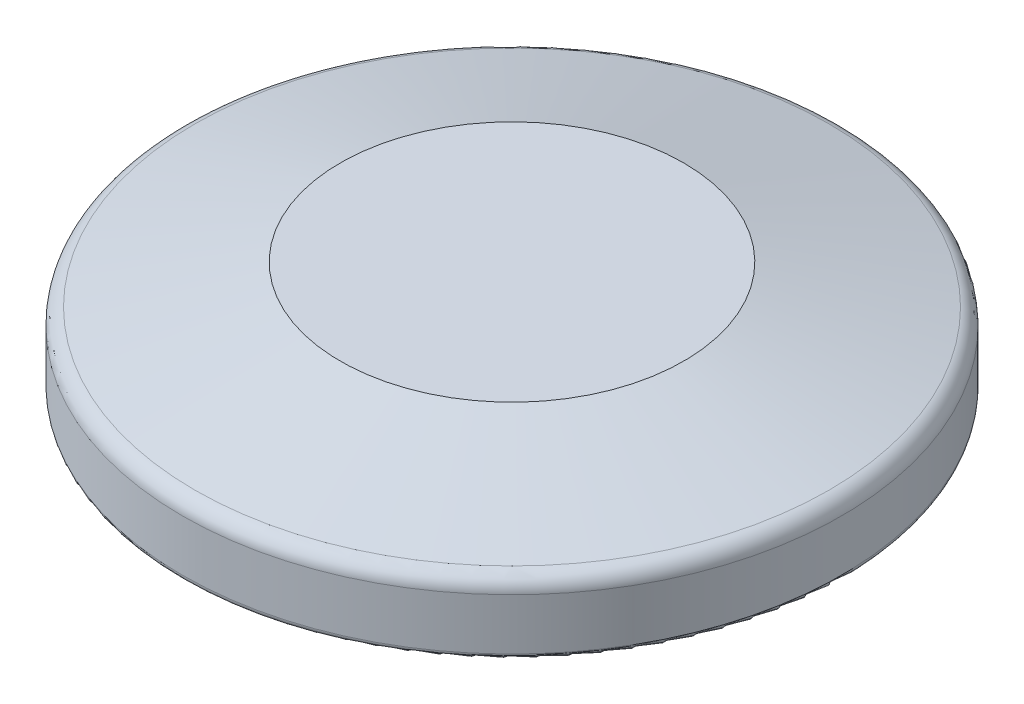
ISO-10303-21;
HEADER;
FILE_DESCRIPTION(('STEP AP214'),'2;1');
FILE_NAME('part.step','',(''),(''),'','','');
FILE_SCHEMA(('AUTOMOTIVE_DESIGN { 1 0 10303 214 1 1 1 1 }'));
ENDSEC;
DATA;
#1=APPLICATION_CONTEXT('core data for automotive mechanical design processes');
#2=APPLICATION_PROTOCOL_DEFINITION('international standard','automotive_design',2000,#1);
#3=PRODUCT_CONTEXT('',#1,'mechanical');
#4=PRODUCT('Part','Part','',(#3));
#5=PRODUCT_RELATED_PRODUCT_CATEGORY('part','',(#4));
#6=PRODUCT_DEFINITION_FORMATION('','',#4);
#7=PRODUCT_DEFINITION_CONTEXT('part definition',#1,'design');
#8=PRODUCT_DEFINITION('design','',#6,#7);
#9=PRODUCT_DEFINITION_SHAPE('','',#8);
#10=(LENGTH_UNIT() NAMED_UNIT(*) SI_UNIT(.MILLI.,.METRE.));
#11=(NAMED_UNIT(*) PLANE_ANGLE_UNIT() SI_UNIT($,.RADIAN.));
#12=(NAMED_UNIT(*) SI_UNIT($,.STERADIAN.) SOLID_ANGLE_UNIT());
#13=UNCERTAINTY_MEASURE_WITH_UNIT(LENGTH_MEASURE(1.E-05),#10,'distance_accuracy_value','');
#14=(GEOMETRIC_REPRESENTATION_CONTEXT(3) GLOBAL_UNCERTAINTY_ASSIGNED_CONTEXT((#13)) GLOBAL_UNIT_ASSIGNED_CONTEXT((#10,
#11,#12)) REPRESENTATION_CONTEXT('',''));
#15=CARTESIAN_POINT('',(0.,0.,0.));
#16=DIRECTION('',(0.,0.,1.));
#17=DIRECTION('',(1.,0.,0.));
#18=AXIS2_PLACEMENT_3D('',#15,#16,#17);
#19=CARTESIAN_POINT('',(0.,0.254000000000001,0.));
#20=DIRECTION('',(0.,1.,0.));
#21=DIRECTION('',(0.,0.,1.));
#22=AXIS2_PLACEMENT_3D('',#19,#20,#21);
#23=TOROIDAL_SURFACE('',#22,14.746,0.254);
#24=CARTESIAN_POINT('',(0.,0.254000000000001,0.));
#25=DIRECTION('',(0.,1.,0.));
#26=DIRECTION('',(0.,0.,1.));
#27=AXIS2_PLACEMENT_3D('',#24,#25,#26);
#28=CIRCLE('',#27,15.);
#29=CARTESIAN_POINT('',(0.,0.254000000000001,15.));
#30=VERTEX_POINT('',#29);
#31=EDGE_CURVE('E70',#30,#30,#28,.T.);
#32=ORIENTED_EDGE('',*,*,#31,.F.);
#33=EDGE_LOOP('',(#32));
#34=FACE_BOUND('',#33,.T.);
#35=CARTESIAN_POINT('',(0.,0.,0.));
#36=DIRECTION('',(0.,-1.,0.));
#37=DIRECTION('',(0.,0.,1.));
#38=AXIS2_PLACEMENT_3D('',#35,#36,#37);
#39=CIRCLE('',#38,14.746);
#40=CARTESIAN_POINT('',(0.,0.,14.746));
#41=VERTEX_POINT('',#40);
#42=EDGE_CURVE('E35',#41,#41,#39,.T.);
#43=ORIENTED_EDGE('',*,*,#42,.F.);
#44=EDGE_LOOP('',(#43));
#45=FACE_BOUND('',#44,.T.);
#46=ADVANCED_FACE('F15',(#34,#45),#23,.T.);
#47=CARTESIAN_POINT('',(0.,2.59029683516003,0.));
#48=DIRECTION('',(0.,1.,0.));
#49=DIRECTION('',(0.,0.,1.));
#50=AXIS2_PLACEMENT_3D('',#47,#48,#49);
#51=TOROIDAL_SURFACE('',#50,14.238,0.762);
#52=CARTESIAN_POINT('',(0.,3.3263323147923,0.));
#53=DIRECTION('',(0.,1.,0.));
#54=DIRECTION('',(0.,0.,1.));
#55=AXIS2_PLACEMENT_3D('',#52,#53,#54);
#56=CIRCLE('',#55,14.4352201123681);
#57=CARTESIAN_POINT('',(0.,3.3263323147923,14.4352201123681));
#58=VERTEX_POINT('',#57);
#59=EDGE_CURVE('E30',#58,#58,#56,.T.);
#60=ORIENTED_EDGE('',*,*,#59,.F.);
#61=EDGE_LOOP('',(#60));
#62=FACE_BOUND('',#61,.T.);
#63=CARTESIAN_POINT('',(0.,2.59029683516003,0.));
#64=DIRECTION('',(0.,-1.,0.));
#65=DIRECTION('',(0.,0.,1.));
#66=AXIS2_PLACEMENT_3D('',#63,#64,#65);
#67=CIRCLE('',#66,15.);
#68=CARTESIAN_POINT('',(0.,2.59029683516003,15.));
#69=VERTEX_POINT('',#68);
#70=EDGE_CURVE('E75',#69,#69,#67,.T.);
#71=ORIENTED_EDGE('',*,*,#70,.F.);
#72=EDGE_LOOP('',(#71));
#73=FACE_BOUND('',#72,.T.);
#74=ADVANCED_FACE('F56',(#62,#73),#51,.T.);
#75=CARTESIAN_POINT('',(0.,0.,0.));
#76=DIRECTION('',(0.,1.,0.));
#77=DIRECTION('',(0.,0.,1.));
#78=AXIS2_PLACEMENT_3D('',#75,#76,#77);
#79=CYLINDRICAL_SURFACE('',#78,4.65);
#80=CARTESIAN_POINT('',(0.,2.5,0.));
#81=DIRECTION('',(0.,1.,0.));
#82=DIRECTION('',(0.,0.,1.));
#83=AXIS2_PLACEMENT_3D('',#80,#81,#82);
#84=CIRCLE('',#83,4.65);
#85=CARTESIAN_POINT('',(0.,2.5,4.65));
#86=VERTEX_POINT('',#85);
#87=EDGE_CURVE('E32',#86,#86,#84,.T.);
#88=ORIENTED_EDGE('',*,*,#87,.F.);
#89=EDGE_LOOP('',(#88));
#90=FACE_BOUND('',#89,.T.);
#91=CARTESIAN_POINT('',(0.,0.,0.));
#92=DIRECTION('',(0.,1.,0.));
#93=DIRECTION('',(0.,0.,1.));
#94=AXIS2_PLACEMENT_3D('',#91,#92,#93);
#95=CIRCLE('',#94,4.65);
#96=CARTESIAN_POINT('',(0.,0.,4.65));
#97=VERTEX_POINT('',#96);
#98=EDGE_CURVE('E10',#97,#97,#95,.T.);
#99=ORIENTED_EDGE('',*,*,#98,.T.);
#100=EDGE_LOOP('',(#99));
#101=FACE_BOUND('',#100,.T.);
#102=ADVANCED_FACE('F45',(#90,#101),#79,.T.);
#103=CARTESIAN_POINT('',(0.,0.,0.));
#104=DIRECTION('',(0.,-1.,0.));
#105=DIRECTION('',(0.,0.,-1.));
#106=AXIS2_PLACEMENT_3D('',#103,#104,#105);
#107=CYLINDRICAL_SURFACE('',#106,8.6);
#108=CARTESIAN_POINT('',(0.,0.,0.));
#109=DIRECTION('',(0.,-1.,0.));
#110=DIRECTION('',(0.,0.,-1.));
#111=AXIS2_PLACEMENT_3D('',#108,#109,#110);
#112=CIRCLE('',#111,8.6);
#113=CARTESIAN_POINT('',(0.,0.,-8.6));
#114=VERTEX_POINT('',#113);
#115=EDGE_CURVE('E23',#114,#114,#112,.T.);
#116=ORIENTED_EDGE('',*,*,#115,.T.);
#117=EDGE_LOOP('',(#116));
#118=FACE_BOUND('',#117,.T.);
#119=CARTESIAN_POINT('',(0.,2.5,0.));
#120=DIRECTION('',(0.,-1.,0.));
#121=DIRECTION('',(0.,0.,-1.));
#122=AXIS2_PLACEMENT_3D('',#119,#120,#121);
#123=CIRCLE('',#122,8.6);
#124=CARTESIAN_POINT('',(0.,2.5,-8.6));
#125=VERTEX_POINT('',#124);
#126=EDGE_CURVE('E36',#125,#125,#123,.T.);
#127=ORIENTED_EDGE('',*,*,#126,.F.);
#128=EDGE_LOOP('',(#127));
#129=FACE_BOUND('',#128,.T.);
#130=ADVANCED_FACE('F42',(#118,#129),#107,.F.);
#131=CARTESIAN_POINT('',(0.,5.1,0.));
#132=DIRECTION('',(0.,-1.,0.));
#133=DIRECTION('',(0.,0.,-1.));
#134=AXIS2_PLACEMENT_3D('',#131,#132,#133);
#135=CONICAL_SURFACE('',#134,7.81580219542982,1.30899693899575);
#136=ORIENTED_EDGE('',*,*,#59,.T.);
#137=EDGE_LOOP('',(#136));
#138=FACE_BOUND('',#137,.T.);
#139=CARTESIAN_POINT('',(0.,5.1,0.));
#140=DIRECTION('',(0.,-1.,0.));
#141=DIRECTION('',(0.,0.,-1.));
#142=AXIS2_PLACEMENT_3D('',#139,#140,#141);
#143=CIRCLE('',#142,7.81580219542982);
#144=CARTESIAN_POINT('',(0.,5.1,-7.81580219542982));
#145=VERTEX_POINT('',#144);
#146=EDGE_CURVE('E19',#145,#145,#143,.T.);
#147=ORIENTED_EDGE('',*,*,#146,.T.);
#148=EDGE_LOOP('',(#147));
#149=FACE_BOUND('',#148,.T.);
#150=ADVANCED_FACE('F44',(#138,#149),#135,.T.);
#151=CARTESIAN_POINT('',(0.,0.,0.));
#152=DIRECTION('',(0.,-1.,0.));
#153=DIRECTION('',(0.,0.,-1.));
#154=AXIS2_PLACEMENT_3D('',#151,#152,#153);
#155=CYLINDRICAL_SURFACE('',#154,15.);
#156=ORIENTED_EDGE('',*,*,#31,.T.);
#157=EDGE_LOOP('',(#156));
#158=FACE_BOUND('',#157,.T.);
#159=ORIENTED_EDGE('',*,*,#70,.T.);
#160=EDGE_LOOP('',(#159));
#161=FACE_BOUND('',#160,.T.);
#162=ADVANCED_FACE('F53',(#158,#161),#155,.T.);
#163=CARTESIAN_POINT('',(0.,0.,8.6));
#164=DIRECTION('',(0.,1.,0.));
#165=DIRECTION('',(0.,0.,1.));
#166=AXIS2_PLACEMENT_3D('',#163,#164,#165);
#167=PLANE('',#166);
#168=ORIENTED_EDGE('',*,*,#42,.T.);
#169=EDGE_LOOP('',(#168));
#170=FACE_BOUND('',#169,.T.);
#171=ORIENTED_EDGE('',*,*,#115,.F.);
#172=EDGE_LOOP('',(#171));
#173=FACE_BOUND('',#172,.T.);
#174=ADVANCED_FACE('F88',(#170,#173),#167,.F.);
#175=CARTESIAN_POINT('',(0.,5.10000000000001,7.81580219542982));
#176=DIRECTION('',(0.,-1.,0.));
#177=DIRECTION('',(0.,0.,-1.));
#178=AXIS2_PLACEMENT_3D('',#175,#176,#177);
#179=PLANE('',#178);
#180=ORIENTED_EDGE('',*,*,#146,.F.);
#181=EDGE_LOOP('',(#180));
#182=FACE_BOUND('',#181,.T.);
#183=ADVANCED_FACE('F86',(#182),#179,.F.);
#184=CARTESIAN_POINT('',(0.,2.5,0.));
#185=DIRECTION('',(0.,1.,0.));
#186=DIRECTION('',(0.,0.,1.));
#187=AXIS2_PLACEMENT_3D('',#184,#185,#186);
#188=PLANE('',#187);
#189=ORIENTED_EDGE('',*,*,#87,.T.);
#190=EDGE_LOOP('',(#189));
#191=FACE_BOUND('',#190,.T.);
#192=ORIENTED_EDGE('',*,*,#126,.T.);
#193=EDGE_LOOP('',(#192));
#194=FACE_BOUND('',#193,.T.);
#195=ADVANCED_FACE('F40',(#191,#194),#188,.F.);
#196=CARTESIAN_POINT('',(0.,0.,0.));
#197=DIRECTION('',(0.,-1.,0.));
#198=DIRECTION('',(0.,0.,-1.));
#199=AXIS2_PLACEMENT_3D('',#196,#197,#198);
#200=PLANE('',#199);
#201=ORIENTED_EDGE('',*,*,#98,.F.);
#202=EDGE_LOOP('',(#201));
#203=FACE_BOUND('',#202,.T.);
#204=ADVANCED_FACE('F17',(#203),#200,.T.);
#205=CLOSED_SHELL('',(#46,#74,#102,#130,#150,#162,#174,#183,#195,#204));
#206=MANIFOLD_SOLID_BREP('B1',#205);
#207=ADVANCED_BREP_SHAPE_REPRESENTATION('',(#18,#206),#14);
#208=SHAPE_DEFINITION_REPRESENTATION(#9,#207);
ENDSEC;
END-ISO-10303-21;
